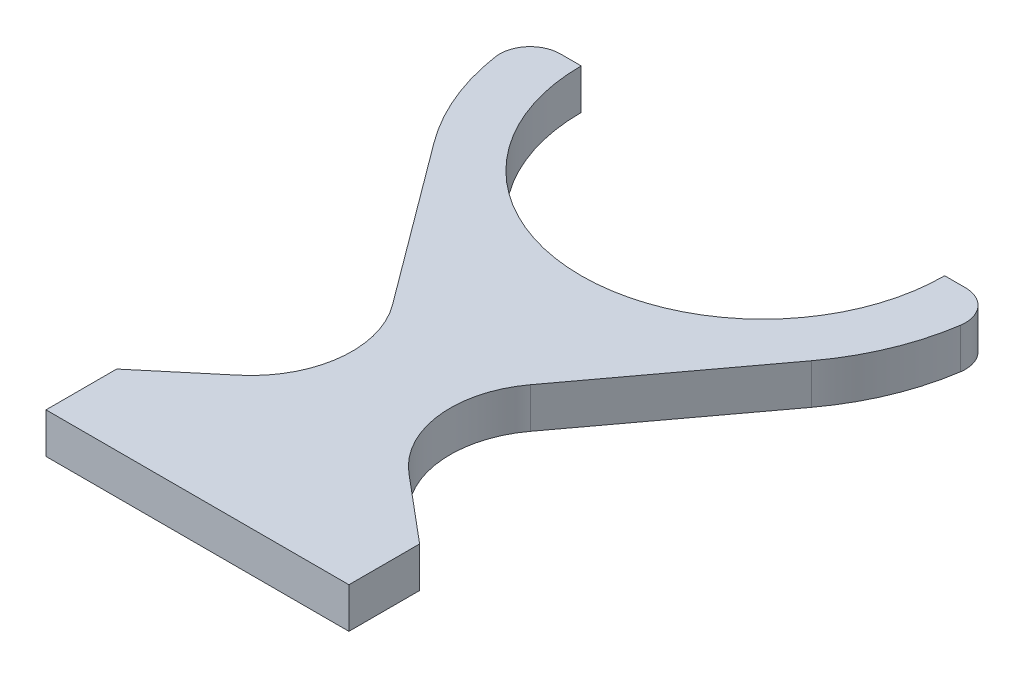
ISO-10303-21;
HEADER;
FILE_DESCRIPTION(('STEP AP214'),'2;1');
FILE_NAME('part.step','',(''),(''),'','','');
FILE_SCHEMA(('AUTOMOTIVE_DESIGN { 1 0 10303 214 1 1 1 1 }'));
ENDSEC;
DATA;
#1=APPLICATION_CONTEXT('core data for automotive mechanical design processes');
#2=APPLICATION_PROTOCOL_DEFINITION('international standard','automotive_design',2000,#1);
#3=PRODUCT_CONTEXT('',#1,'mechanical');
#4=PRODUCT('Part','Part','',(#3));
#5=PRODUCT_RELATED_PRODUCT_CATEGORY('part','',(#4));
#6=PRODUCT_DEFINITION_FORMATION('','',#4);
#7=PRODUCT_DEFINITION_CONTEXT('part definition',#1,'design');
#8=PRODUCT_DEFINITION('design','',#6,#7);
#9=PRODUCT_DEFINITION_SHAPE('','',#8);
#10=(LENGTH_UNIT() NAMED_UNIT(*) SI_UNIT(.MILLI.,.METRE.));
#11=(NAMED_UNIT(*) PLANE_ANGLE_UNIT() SI_UNIT($,.RADIAN.));
#12=(NAMED_UNIT(*) SI_UNIT($,.STERADIAN.) SOLID_ANGLE_UNIT());
#13=UNCERTAINTY_MEASURE_WITH_UNIT(LENGTH_MEASURE(1.E-05),#10,'distance_accuracy_value','');
#14=(GEOMETRIC_REPRESENTATION_CONTEXT(3) GLOBAL_UNCERTAINTY_ASSIGNED_CONTEXT((#13)) GLOBAL_UNIT_ASSIGNED_CONTEXT((#10,
#11,#12)) REPRESENTATION_CONTEXT('',''));
#15=CARTESIAN_POINT('',(0.,0.,0.));
#16=DIRECTION('',(0.,0.,1.));
#17=DIRECTION('',(1.,0.,0.));
#18=AXIS2_PLACEMENT_3D('',#15,#16,#17);
#19=CARTESIAN_POINT('',(0.,20.,0.));
#20=DIRECTION('',(0.,1.,0.));
#21=DIRECTION('',(0.,0.,1.));
#22=AXIS2_PLACEMENT_3D('',#19,#20,#21);
#23=PLANE('',#22);
#24=CARTESIAN_POINT('',(0.,20.,-280.));
#25=DIRECTION('',(0.,1.,0.));
#26=DIRECTION('',(0.,0.,1.));
#27=AXIS2_PLACEMENT_3D('',#24,#25,#26);
#28=CIRCLE('',#27,116.421991203938);
#29=CARTESIAN_POINT('',(93.4764140406187,20.,-210.60086416967));
#30=VERTEX_POINT('',#29);
#31=CARTESIAN_POINT('',(115.141673104201,20.,-262.781546217648));
#32=VERTEX_POINT('',#31);
#33=EDGE_CURVE('E314',#30,#32,#28,.T.);
#34=ORIENTED_EDGE('',*,*,#33,.T.);
#35=CARTESIAN_POINT('',(100.306631384827,20.,-265.));
#36=DIRECTION('',(0.,1.,0.));
#37=DIRECTION('',(0.,0.,1.));
#38=AXIS2_PLACEMENT_3D('',#35,#36,#37);
#39=CIRCLE('',#38,15.);
#40=CARTESIAN_POINT('',(100.306631384827,20.,-280.));
#41=VERTEX_POINT('',#40);
#42=EDGE_CURVE('E68',#32,#41,#39,.T.);
#43=ORIENTED_EDGE('',*,*,#42,.T.);
#44=DIRECTION('',(1.,0.,0.));
#45=VECTOR('',#44,1.);
#46=CARTESIAN_POINT('',(0.,20.,-280.));
#47=LINE('',#46,#45);
#48=CARTESIAN_POINT('',(90.,20.,-280.));
#49=VERTEX_POINT('',#48);
#50=EDGE_CURVE('E171',#49,#41,#47,.T.);
#51=ORIENTED_EDGE('',*,*,#50,.F.);
#52=CARTESIAN_POINT('',(0.,20.,-280.));
#53=DIRECTION('',(0.,1.,0.));
#54=DIRECTION('',(0.,0.,1.));
#55=AXIS2_PLACEMENT_3D('',#52,#53,#54);
#56=CIRCLE('',#55,90.);
#57=CARTESIAN_POINT('',(-90.,20.,-280.));
#58=VERTEX_POINT('',#57);
#59=EDGE_CURVE('E159',#58,#49,#56,.T.);
#60=ORIENTED_EDGE('',*,*,#59,.F.);
#61=DIRECTION('',(-1.,0.,0.));
#62=VECTOR('',#61,1.);
#63=CARTESIAN_POINT('',(0.,20.,-280.));
#64=LINE('',#63,#62);
#65=CARTESIAN_POINT('',(-100.306631384827,20.,-280.));
#66=VERTEX_POINT('',#65);
#67=EDGE_CURVE('E233',#58,#66,#64,.T.);
#68=ORIENTED_EDGE('',*,*,#67,.T.);
#69=CARTESIAN_POINT('',(-100.306631384827,20.,-265.));
#70=DIRECTION('',(0.,1.,0.));
#71=DIRECTION('',(0.,0.,1.));
#72=AXIS2_PLACEMENT_3D('',#69,#70,#71);
#73=CIRCLE('',#72,15.);
#74=CARTESIAN_POINT('',(-115.141673104201,20.,-262.781546217648));
#75=VERTEX_POINT('',#74);
#76=EDGE_CURVE('E280',#66,#75,#73,.T.);
#77=ORIENTED_EDGE('',*,*,#76,.T.);
#78=CARTESIAN_POINT('',(0.,20.,-280.));
#79=DIRECTION('',(0.,-1.,0.));
#80=DIRECTION('',(0.,0.,1.));
#81=AXIS2_PLACEMENT_3D('',#78,#79,#80);
#82=CIRCLE('',#81,116.421991203938);
#83=CARTESIAN_POINT('',(-93.4764140406187,20.,-210.60086416967));
#84=VERTEX_POINT('',#83);
#85=EDGE_CURVE('E168',#84,#75,#82,.T.);
#86=ORIENTED_EDGE('',*,*,#85,.F.);
#87=DIRECTION('',(0.596099887252078,0.,0.802910284165087));
#88=VECTOR('',#87,1.);
#89=CARTESIAN_POINT('',(-6.05600011929235,20.,-92.850884871789));
#90=LINE('',#89,#88);
#91=CARTESIAN_POINT('',(-34.1384260953024,20.,-130.676204256405));
#92=VERTEX_POINT('',#91);
#93=EDGE_CURVE('E236',#84,#92,#90,.T.);
#94=ORIENTED_EDGE('',*,*,#93,.T.);
#95=CARTESIAN_POINT('',(-74.2839403035567,20.,-100.871209893801));
#96=DIRECTION('',(0.,1.,0.));
#97=DIRECTION('',(0.,0.,1.));
#98=AXIS2_PLACEMENT_3D('',#95,#96,#97);
#99=CIRCLE('',#98,50.);
#100=CARTESIAN_POINT('',(-42.1445598192295,20.,-62.5689877378521));
#101=VERTEX_POINT('',#100);
#102=EDGE_CURVE('E273',#92,#101,#99,.F.);
#103=ORIENTED_EDGE('',*,*,#102,.T.);
#104=DIRECTION('',(-0.766044443118974,0.,0.642787609686544));
#105=VECTOR('',#104,1.);
#106=CARTESIAN_POINT('',(-75.,20.,-35.));
#107=LINE('',#106,#105);
#108=CARTESIAN_POINT('',(-75.,20.,-35.));
#109=VERTEX_POINT('',#108);
#110=EDGE_CURVE('E223',#101,#109,#107,.T.);
#111=ORIENTED_EDGE('',*,*,#110,.T.);
#112=DIRECTION('',(0.,0.,1.));
#113=VECTOR('',#112,1.);
#114=CARTESIAN_POINT('',(-75.,20.,-35.));
#115=LINE('',#114,#113);
#116=CARTESIAN_POINT('',(-75.,20.,0.));
#117=VERTEX_POINT('',#116);
#118=EDGE_CURVE('E226',#109,#117,#115,.T.);
#119=ORIENTED_EDGE('',*,*,#118,.T.);
#120=DIRECTION('',(1.,0.,0.));
#121=VECTOR('',#120,1.);
#122=CARTESIAN_POINT('',(-75.,20.,0.));
#123=LINE('',#122,#121);
#124=CARTESIAN_POINT('',(75.,20.,0.));
#125=VERTEX_POINT('',#124);
#126=EDGE_CURVE('E230',#117,#125,#123,.T.);
#127=ORIENTED_EDGE('',*,*,#126,.T.);
#128=DIRECTION('',(0.,0.,1.));
#129=VECTOR('',#128,1.);
#130=CARTESIAN_POINT('',(75.,20.,-35.));
#131=LINE('',#130,#129);
#132=CARTESIAN_POINT('',(75.,20.,-35.));
#133=VERTEX_POINT('',#132);
#134=EDGE_CURVE('E178',#133,#125,#131,.T.);
#135=ORIENTED_EDGE('',*,*,#134,.F.);
#136=DIRECTION('',(0.766044443118974,0.,0.642787609686544));
#137=VECTOR('',#136,1.);
#138=CARTESIAN_POINT('',(75.,20.,-35.));
#139=LINE('',#138,#137);
#140=CARTESIAN_POINT('',(42.1445598192295,20.,-62.5689877378521));
#141=VERTEX_POINT('',#140);
#142=EDGE_CURVE('E186',#141,#133,#139,.T.);
#143=ORIENTED_EDGE('',*,*,#142,.F.);
#144=CARTESIAN_POINT('',(74.2839403035567,20.,-100.871209893801));
#145=DIRECTION('',(0.,1.,0.));
#146=DIRECTION('',(0.,0.,1.));
#147=AXIS2_PLACEMENT_3D('',#144,#145,#146);
#148=CIRCLE('',#147,50.);
#149=CARTESIAN_POINT('',(34.1384260953024,20.,-130.676204256405));
#150=VERTEX_POINT('',#149);
#151=EDGE_CURVE('E299',#141,#150,#148,.F.);
#152=ORIENTED_EDGE('',*,*,#151,.T.);
#153=DIRECTION('',(-0.596099887252078,0.,0.802910284165087));
#154=VECTOR('',#153,1.);
#155=CARTESIAN_POINT('',(6.05600011929235,20.,-92.850884871789));
#156=LINE('',#155,#154);
#157=EDGE_CURVE('E179',#30,#150,#156,.T.);
#158=ORIENTED_EDGE('',*,*,#157,.F.);
#159=EDGE_LOOP('',(#34,#43,#51,#60,#68,#77,#86,#94,#103,#111,#119,#127,#135,#143,#152,#158));
#160=FACE_BOUND('',#159,.T.);
#161=ADVANCED_FACE('F45',(#160),#23,.T.);
#162=CARTESIAN_POINT('',(0.,0.,0.));
#163=DIRECTION('',(0.,1.,0.));
#164=DIRECTION('',(0.,0.,1.));
#165=AXIS2_PLACEMENT_3D('',#162,#163,#164);
#166=PLANE('',#165);
#167=DIRECTION('',(1.,0.,0.));
#168=VECTOR('',#167,1.);
#169=CARTESIAN_POINT('',(0.,0.,-280.));
#170=LINE('',#169,#168);
#171=CARTESIAN_POINT('',(90.,0.,-280.));
#172=VERTEX_POINT('',#171);
#173=CARTESIAN_POINT('',(100.306631384827,0.,-280.));
#174=VERTEX_POINT('',#173);
#175=EDGE_CURVE('E172',#172,#174,#170,.T.);
#176=ORIENTED_EDGE('',*,*,#175,.T.);
#177=CARTESIAN_POINT('',(100.306631384827,0.,-265.));
#178=DIRECTION('',(0.,1.,0.));
#179=DIRECTION('',(0.,0.,1.));
#180=AXIS2_PLACEMENT_3D('',#177,#178,#179);
#181=CIRCLE('',#180,15.);
#182=CARTESIAN_POINT('',(115.141673104201,0.,-262.781546217648));
#183=VERTEX_POINT('',#182);
#184=EDGE_CURVE('E11',#174,#183,#181,.F.);
#185=ORIENTED_EDGE('',*,*,#184,.T.);
#186=CARTESIAN_POINT('',(0.,0.,-280.));
#187=DIRECTION('',(0.,1.,0.));
#188=DIRECTION('',(0.,0.,1.));
#189=AXIS2_PLACEMENT_3D('',#186,#187,#188);
#190=CIRCLE('',#189,116.421991203938);
#191=CARTESIAN_POINT('',(93.4764140406187,0.,-210.60086416967));
#192=VERTEX_POINT('',#191);
#193=EDGE_CURVE('E175',#183,#192,#190,.F.);
#194=ORIENTED_EDGE('',*,*,#193,.T.);
#195=DIRECTION('',(-0.596099887252078,0.,0.802910284165087));
#196=VECTOR('',#195,1.);
#197=CARTESIAN_POINT('',(6.05600011929235,0.,-92.850884871789));
#198=LINE('',#197,#196);
#199=CARTESIAN_POINT('',(34.1384260953024,0.,-130.676204256405));
#200=VERTEX_POINT('',#199);
#201=EDGE_CURVE('E192',#192,#200,#198,.T.);
#202=ORIENTED_EDGE('',*,*,#201,.T.);
#203=CARTESIAN_POINT('',(74.2839403035567,0.,-100.871209893801));
#204=DIRECTION('',(0.,1.,0.));
#205=DIRECTION('',(0.,0.,1.));
#206=AXIS2_PLACEMENT_3D('',#203,#204,#205);
#207=CIRCLE('',#206,50.);
#208=CARTESIAN_POINT('',(42.1445598192295,0.,-62.5689877378521));
#209=VERTEX_POINT('',#208);
#210=EDGE_CURVE('E296',#200,#209,#207,.T.);
#211=ORIENTED_EDGE('',*,*,#210,.T.);
#212=DIRECTION('',(0.766044443118974,0.,0.642787609686544));
#213=VECTOR('',#212,1.);
#214=CARTESIAN_POINT('',(75.,0.,-35.));
#215=LINE('',#214,#213);
#216=CARTESIAN_POINT('',(75.,0.,-35.));
#217=VERTEX_POINT('',#216);
#218=EDGE_CURVE('E174',#209,#217,#215,.T.);
#219=ORIENTED_EDGE('',*,*,#218,.T.);
#220=DIRECTION('',(0.,0.,1.));
#221=VECTOR('',#220,1.);
#222=CARTESIAN_POINT('',(75.,0.,-35.));
#223=LINE('',#222,#221);
#224=CARTESIAN_POINT('',(75.,0.,0.));
#225=VERTEX_POINT('',#224);
#226=EDGE_CURVE('E197',#217,#225,#223,.T.);
#227=ORIENTED_EDGE('',*,*,#226,.T.);
#228=DIRECTION('',(1.,0.,0.));
#229=VECTOR('',#228,1.);
#230=CARTESIAN_POINT('',(-75.,0.,0.));
#231=LINE('',#230,#229);
#232=CARTESIAN_POINT('',(-75.,0.,0.));
#233=VERTEX_POINT('',#232);
#234=EDGE_CURVE('E245',#233,#225,#231,.T.);
#235=ORIENTED_EDGE('',*,*,#234,.F.);
#236=DIRECTION('',(0.,0.,1.));
#237=VECTOR('',#236,1.);
#238=CARTESIAN_POINT('',(-75.,0.,-35.));
#239=LINE('',#238,#237);
#240=CARTESIAN_POINT('',(-75.,0.,-35.));
#241=VERTEX_POINT('',#240);
#242=EDGE_CURVE('E242',#241,#233,#239,.T.);
#243=ORIENTED_EDGE('',*,*,#242,.F.);
#244=DIRECTION('',(-0.766044443118974,0.,0.642787609686544));
#245=VECTOR('',#244,1.);
#246=CARTESIAN_POINT('',(-75.,0.,-35.));
#247=LINE('',#246,#245);
#248=CARTESIAN_POINT('',(-42.1445598192295,0.,-62.5689877378521));
#249=VERTEX_POINT('',#248);
#250=EDGE_CURVE('E214',#249,#241,#247,.T.);
#251=ORIENTED_EDGE('',*,*,#250,.F.);
#252=CARTESIAN_POINT('',(-74.2839403035567,0.,-100.871209893801));
#253=DIRECTION('',(0.,1.,0.));
#254=DIRECTION('',(0.,0.,1.));
#255=AXIS2_PLACEMENT_3D('',#252,#253,#254);
#256=CIRCLE('',#255,50.);
#257=CARTESIAN_POINT('',(-34.1384260953024,0.,-130.676204256405));
#258=VERTEX_POINT('',#257);
#259=EDGE_CURVE('E269',#249,#258,#256,.T.);
#260=ORIENTED_EDGE('',*,*,#259,.T.);
#261=DIRECTION('',(0.596099887252078,0.,0.802910284165087));
#262=VECTOR('',#261,1.);
#263=CARTESIAN_POINT('',(-6.05600011929235,0.,-92.850884871789));
#264=LINE('',#263,#262);
#265=CARTESIAN_POINT('',(-93.4764140406187,0.,-210.60086416967));
#266=VERTEX_POINT('',#265);
#267=EDGE_CURVE('E227',#266,#258,#264,.T.);
#268=ORIENTED_EDGE('',*,*,#267,.F.);
#269=CARTESIAN_POINT('',(0.,0.,-280.));
#270=DIRECTION('',(0.,1.,0.));
#271=DIRECTION('',(0.,0.,1.));
#272=AXIS2_PLACEMENT_3D('',#269,#270,#271);
#273=CIRCLE('',#272,116.421991203938);
#274=CARTESIAN_POINT('',(-115.141673104201,0.,-262.781546217648));
#275=VERTEX_POINT('',#274);
#276=EDGE_CURVE('E207',#275,#266,#273,.T.);
#277=ORIENTED_EDGE('',*,*,#276,.F.);
#278=CARTESIAN_POINT('',(-100.306631384827,0.,-265.));
#279=DIRECTION('',(0.,1.,0.));
#280=DIRECTION('',(0.,0.,1.));
#281=AXIS2_PLACEMENT_3D('',#278,#279,#280);
#282=CIRCLE('',#281,15.);
#283=CARTESIAN_POINT('',(-100.306631384827,0.,-280.));
#284=VERTEX_POINT('',#283);
#285=EDGE_CURVE('E286',#275,#284,#282,.F.);
#286=ORIENTED_EDGE('',*,*,#285,.T.);
#287=DIRECTION('',(-1.,0.,0.));
#288=VECTOR('',#287,1.);
#289=CARTESIAN_POINT('',(0.,0.,-280.));
#290=LINE('',#289,#288);
#291=CARTESIAN_POINT('',(-90.,0.,-280.));
#292=VERTEX_POINT('',#291);
#293=EDGE_CURVE('E248',#292,#284,#290,.T.);
#294=ORIENTED_EDGE('',*,*,#293,.F.);
#295=CARTESIAN_POINT('',(0.,0.,-280.));
#296=DIRECTION('',(0.,1.,0.));
#297=DIRECTION('',(0.,0.,1.));
#298=AXIS2_PLACEMENT_3D('',#295,#296,#297);
#299=CIRCLE('',#298,90.);
#300=EDGE_CURVE('E211',#172,#292,#299,.F.);
#301=ORIENTED_EDGE('',*,*,#300,.F.);
#302=EDGE_LOOP('',(#176,#185,#194,#202,#211,#219,#227,#235,#243,#251,#260,#268,#277,#286,#294,#301));
#303=FACE_BOUND('',#302,.T.);
#304=ADVANCED_FACE('F346',(#303),#166,.F.);
#305=CARTESIAN_POINT('',(6.05600011929235,20.,-92.850884871789));
#306=DIRECTION('',(0.802910284165087,0.,0.596099887252078));
#307=DIRECTION('',(0.596099887252078,0.,-0.802910284165087));
#308=AXIS2_PLACEMENT_3D('',#305,#306,#307);
#309=PLANE('',#308);
#310=ORIENTED_EDGE('',*,*,#201,.F.);
#311=DIRECTION('',(0.,1.,0.));
#312=VECTOR('',#311,1.);
#313=CARTESIAN_POINT('',(93.4764140406187,-127.279220613579,-210.60086416967));
#314=LINE('',#313,#312);
#315=EDGE_CURVE('E320',#192,#30,#314,.T.);
#316=ORIENTED_EDGE('',*,*,#315,.T.);
#317=ORIENTED_EDGE('',*,*,#157,.T.);
#318=DIRECTION('',(0.,-1.,0.));
#319=VECTOR('',#318,1.);
#320=CARTESIAN_POINT('',(34.1384260953024,0.,-130.676204256405));
#321=LINE('',#320,#319);
#322=EDGE_CURVE('E289',#150,#200,#321,.T.);
#323=ORIENTED_EDGE('',*,*,#322,.T.);
#324=EDGE_LOOP('',(#310,#316,#317,#323));
#325=FACE_BOUND('',#324,.T.);
#326=ADVANCED_FACE('F354',(#325),#309,.T.);
#327=CARTESIAN_POINT('',(0.,20.,-280.));
#328=DIRECTION('',(0.,0.,-1.));
#329=DIRECTION('',(-1.,0.,0.));
#330=AXIS2_PLACEMENT_3D('',#327,#328,#329);
#331=PLANE('',#330);
#332=ORIENTED_EDGE('',*,*,#50,.T.);
#333=DIRECTION('',(0.,1.,0.));
#334=VECTOR('',#333,1.);
#335=CARTESIAN_POINT('',(100.306631384827,20.,-280.));
#336=LINE('',#335,#334);
#337=EDGE_CURVE('E54',#41,#174,#336,.F.);
#338=ORIENTED_EDGE('',*,*,#337,.T.);
#339=ORIENTED_EDGE('',*,*,#175,.F.);
#340=DIRECTION('',(0.,1.,0.));
#341=VECTOR('',#340,1.);
#342=CARTESIAN_POINT('',(90.,-127.279220613579,-280.));
#343=LINE('',#342,#341);
#344=EDGE_CURVE('E162',#172,#49,#343,.T.);
#345=ORIENTED_EDGE('',*,*,#344,.T.);
#346=EDGE_LOOP('',(#332,#338,#339,#345));
#347=FACE_BOUND('',#346,.T.);
#348=ADVANCED_FACE('F170',(#347),#331,.T.);
#349=CARTESIAN_POINT('',(-75.,20.,-35.));
#350=DIRECTION('',(0.642787609686545,0.,0.766044443118974));
#351=DIRECTION('',(0.766044443118974,0.,-0.642787609686545));
#352=AXIS2_PLACEMENT_3D('',#349,#350,#351);
#353=PLANE('',#352);
#354=ORIENTED_EDGE('',*,*,#110,.F.);
#355=DIRECTION('',(0.,-1.,0.));
#356=VECTOR('',#355,1.);
#357=CARTESIAN_POINT('',(-42.1445598192295,0.,-62.5689877378521));
#358=LINE('',#357,#356);
#359=EDGE_CURVE('E261',#101,#249,#358,.T.);
#360=ORIENTED_EDGE('',*,*,#359,.T.);
#361=ORIENTED_EDGE('',*,*,#250,.T.);
#362=DIRECTION('',(0.,-1.,0.));
#363=VECTOR('',#362,1.);
#364=CARTESIAN_POINT('',(-75.,20.,-35.));
#365=LINE('',#364,#363);
#366=EDGE_CURVE('E257',#109,#241,#365,.T.);
#367=ORIENTED_EDGE('',*,*,#366,.F.);
#368=EDGE_LOOP('',(#354,#360,#361,#367));
#369=FACE_BOUND('',#368,.T.);
#370=ADVANCED_FACE('F385',(#369),#353,.F.);
#371=CARTESIAN_POINT('',(-75.,20.,-35.));
#372=DIRECTION('',(1.,0.,0.));
#373=DIRECTION('',(0.,0.,-1.));
#374=AXIS2_PLACEMENT_3D('',#371,#372,#373);
#375=PLANE('',#374);
#376=ORIENTED_EDGE('',*,*,#242,.T.);
#377=DIRECTION('',(0.,-1.,0.));
#378=VECTOR('',#377,1.);
#379=CARTESIAN_POINT('',(-75.,20.,0.));
#380=LINE('',#379,#378);
#381=EDGE_CURVE('E239',#117,#233,#380,.T.);
#382=ORIENTED_EDGE('',*,*,#381,.F.);
#383=ORIENTED_EDGE('',*,*,#118,.F.);
#384=ORIENTED_EDGE('',*,*,#366,.T.);
#385=EDGE_LOOP('',(#376,#382,#383,#384));
#386=FACE_BOUND('',#385,.T.);
#387=ADVANCED_FACE('F382',(#386),#375,.F.);
#388=CARTESIAN_POINT('',(-75.,20.,0.));
#389=DIRECTION('',(0.,0.,-1.));
#390=DIRECTION('',(-1.,0.,0.));
#391=AXIS2_PLACEMENT_3D('',#388,#389,#390);
#392=PLANE('',#391);
#393=ORIENTED_EDGE('',*,*,#234,.T.);
#394=DIRECTION('',(0.,-1.,0.));
#395=VECTOR('',#394,1.);
#396=CARTESIAN_POINT('',(75.,20.,0.));
#397=LINE('',#396,#395);
#398=EDGE_CURVE('E204',#125,#225,#397,.T.);
#399=ORIENTED_EDGE('',*,*,#398,.F.);
#400=ORIENTED_EDGE('',*,*,#126,.F.);
#401=ORIENTED_EDGE('',*,*,#381,.T.);
#402=EDGE_LOOP('',(#393,#399,#400,#401));
#403=FACE_BOUND('',#402,.T.);
#404=ADVANCED_FACE('F343',(#403),#392,.F.);
#405=CARTESIAN_POINT('',(0.,20.,-280.));
#406=DIRECTION('',(0.,0.,1.));
#407=DIRECTION('',(1.,0.,0.));
#408=AXIS2_PLACEMENT_3D('',#405,#406,#407);
#409=PLANE('',#408);
#410=ORIENTED_EDGE('',*,*,#293,.T.);
#411=DIRECTION('',(0.,1.,0.));
#412=VECTOR('',#411,1.);
#413=CARTESIAN_POINT('',(-100.306631384827,20.,-280.));
#414=LINE('',#413,#412);
#415=EDGE_CURVE('E276',#284,#66,#414,.T.);
#416=ORIENTED_EDGE('',*,*,#415,.T.);
#417=ORIENTED_EDGE('',*,*,#67,.F.);
#418=DIRECTION('',(0.,1.,0.));
#419=VECTOR('',#418,1.);
#420=CARTESIAN_POINT('',(-90.,-127.279220613579,-280.));
#421=LINE('',#420,#419);
#422=EDGE_CURVE('E164',#292,#58,#421,.T.);
#423=ORIENTED_EDGE('',*,*,#422,.F.);
#424=EDGE_LOOP('',(#410,#416,#417,#423));
#425=FACE_BOUND('',#424,.T.);
#426=ADVANCED_FACE('F375',(#425),#409,.F.);
#427=CARTESIAN_POINT('',(-6.05600011929235,20.,-92.850884871789));
#428=DIRECTION('',(0.802910284165087,0.,-0.596099887252078));
#429=DIRECTION('',(-0.596099887252078,0.,-0.802910284165087));
#430=AXIS2_PLACEMENT_3D('',#427,#428,#429);
#431=PLANE('',#430);
#432=ORIENTED_EDGE('',*,*,#93,.F.);
#433=DIRECTION('',(0.,1.,0.));
#434=VECTOR('',#433,1.);
#435=CARTESIAN_POINT('',(-93.4764140406187,-127.279220613579,-210.60086416967));
#436=LINE('',#435,#434);
#437=EDGE_CURVE('E215',#266,#84,#436,.T.);
#438=ORIENTED_EDGE('',*,*,#437,.F.);
#439=ORIENTED_EDGE('',*,*,#267,.T.);
#440=DIRECTION('',(0.,-1.,0.));
#441=VECTOR('',#440,1.);
#442=CARTESIAN_POINT('',(-34.1384260953024,20.,-130.676204256405));
#443=LINE('',#442,#441);
#444=EDGE_CURVE('E265',#258,#92,#443,.F.);
#445=ORIENTED_EDGE('',*,*,#444,.T.);
#446=EDGE_LOOP('',(#432,#438,#439,#445));
#447=FACE_BOUND('',#446,.T.);
#448=ADVANCED_FACE('F371',(#447),#431,.F.);
#449=CARTESIAN_POINT('',(-74.2839403035567,20.,-100.871209893801));
#450=DIRECTION('',(0.,1.,0.));
#451=DIRECTION('',(0.,0.,1.));
#452=AXIS2_PLACEMENT_3D('',#449,#450,#451);
#453=CYLINDRICAL_SURFACE('',#452,50.);
#454=ORIENTED_EDGE('',*,*,#102,.F.);
#455=ORIENTED_EDGE('',*,*,#444,.F.);
#456=ORIENTED_EDGE('',*,*,#259,.F.);
#457=ORIENTED_EDGE('',*,*,#359,.F.);
#458=EDGE_LOOP('',(#454,#455,#456,#457));
#459=FACE_BOUND('',#458,.T.);
#460=ADVANCED_FACE('F374',(#459),#453,.F.);
#461=CARTESIAN_POINT('',(0.,-127.279220613579,-280.));
#462=DIRECTION('',(0.,1.,0.));
#463=DIRECTION('',(0.,0.,1.));
#464=AXIS2_PLACEMENT_3D('',#461,#462,#463);
#465=CYLINDRICAL_SURFACE('',#464,116.421991203938);
#466=ORIENTED_EDGE('',*,*,#85,.T.);
#467=DIRECTION('',(0.,1.,0.));
#468=VECTOR('',#467,1.);
#469=CARTESIAN_POINT('',(-115.141673104201,-127.279220613579,-262.781546217648));
#470=LINE('',#469,#468);
#471=EDGE_CURVE('E283',#75,#275,#470,.F.);
#472=ORIENTED_EDGE('',*,*,#471,.T.);
#473=ORIENTED_EDGE('',*,*,#276,.T.);
#474=ORIENTED_EDGE('',*,*,#437,.T.);
#475=EDGE_LOOP('',(#466,#472,#473,#474));
#476=FACE_BOUND('',#475,.T.);
#477=ADVANCED_FACE('F368',(#476),#465,.T.);
#478=CARTESIAN_POINT('',(0.,-127.279220613579,-280.));
#479=DIRECTION('',(0.,1.,0.));
#480=DIRECTION('',(0.,0.,1.));
#481=AXIS2_PLACEMENT_3D('',#478,#479,#480);
#482=CYLINDRICAL_SURFACE('',#481,90.);
#483=ORIENTED_EDGE('',*,*,#300,.T.);
#484=ORIENTED_EDGE('',*,*,#422,.T.);
#485=ORIENTED_EDGE('',*,*,#59,.T.);
#486=ORIENTED_EDGE('',*,*,#344,.F.);
#487=EDGE_LOOP('',(#483,#484,#485,#486));
#488=FACE_BOUND('',#487,.T.);
#489=ADVANCED_FACE('F161',(#488),#482,.F.);
#490=CARTESIAN_POINT('',(-100.306631384827,-127.279220613579,-265.));
#491=DIRECTION('',(0.,1.,0.));
#492=DIRECTION('',(0.,0.,1.));
#493=AXIS2_PLACEMENT_3D('',#490,#491,#492);
#494=CYLINDRICAL_SURFACE('',#493,15.);
#495=ORIENTED_EDGE('',*,*,#285,.F.);
#496=ORIENTED_EDGE('',*,*,#471,.F.);
#497=ORIENTED_EDGE('',*,*,#76,.F.);
#498=ORIENTED_EDGE('',*,*,#415,.F.);
#499=EDGE_LOOP('',(#495,#496,#497,#498));
#500=FACE_BOUND('',#499,.T.);
#501=ADVANCED_FACE('F393',(#500),#494,.T.);
#502=CARTESIAN_POINT('',(75.,20.,-35.));
#503=DIRECTION('',(0.642787609686545,0.,-0.766044443118974));
#504=DIRECTION('',(-0.766044443118974,0.,-0.642787609686545));
#505=AXIS2_PLACEMENT_3D('',#502,#503,#504);
#506=PLANE('',#505);
#507=ORIENTED_EDGE('',*,*,#218,.F.);
#508=DIRECTION('',(0.,-1.,0.));
#509=VECTOR('',#508,1.);
#510=CARTESIAN_POINT('',(42.1445598192295,20.,-62.5689877378521));
#511=LINE('',#510,#509);
#512=EDGE_CURVE('E293',#209,#141,#511,.F.);
#513=ORIENTED_EDGE('',*,*,#512,.T.);
#514=ORIENTED_EDGE('',*,*,#142,.T.);
#515=DIRECTION('',(0.,-1.,0.));
#516=VECTOR('',#515,1.);
#517=CARTESIAN_POINT('',(75.,20.,-35.));
#518=LINE('',#517,#516);
#519=EDGE_CURVE('E184',#133,#217,#518,.T.);
#520=ORIENTED_EDGE('',*,*,#519,.T.);
#521=EDGE_LOOP('',(#507,#513,#514,#520));
#522=FACE_BOUND('',#521,.T.);
#523=ADVANCED_FACE('F331',(#522),#506,.T.);
#524=CARTESIAN_POINT('',(75.,20.,-35.));
#525=DIRECTION('',(1.,0.,0.));
#526=DIRECTION('',(0.,0.,-1.));
#527=AXIS2_PLACEMENT_3D('',#524,#525,#526);
#528=PLANE('',#527);
#529=ORIENTED_EDGE('',*,*,#226,.F.);
#530=ORIENTED_EDGE('',*,*,#519,.F.);
#531=ORIENTED_EDGE('',*,*,#134,.T.);
#532=ORIENTED_EDGE('',*,*,#398,.T.);
#533=EDGE_LOOP('',(#529,#530,#531,#532));
#534=FACE_BOUND('',#533,.T.);
#535=ADVANCED_FACE('F337',(#534),#528,.T.);
#536=CARTESIAN_POINT('',(74.2839403035567,20.,-100.871209893801));
#537=DIRECTION('',(0.,1.,0.));
#538=DIRECTION('',(0.,0.,1.));
#539=AXIS2_PLACEMENT_3D('',#536,#537,#538);
#540=CYLINDRICAL_SURFACE('',#539,50.);
#541=ORIENTED_EDGE('',*,*,#151,.F.);
#542=ORIENTED_EDGE('',*,*,#512,.F.);
#543=ORIENTED_EDGE('',*,*,#210,.F.);
#544=ORIENTED_EDGE('',*,*,#322,.F.);
#545=EDGE_LOOP('',(#541,#542,#543,#544));
#546=FACE_BOUND('',#545,.T.);
#547=ADVANCED_FACE('F350',(#546),#540,.F.);
#548=CARTESIAN_POINT('',(0.,-127.279220613579,-280.));
#549=DIRECTION('',(0.,1.,0.));
#550=DIRECTION('',(0.,0.,1.));
#551=AXIS2_PLACEMENT_3D('',#548,#549,#550);
#552=CYLINDRICAL_SURFACE('',#551,116.421991203938);
#553=ORIENTED_EDGE('',*,*,#193,.F.);
#554=DIRECTION('',(0.,1.,0.));
#555=VECTOR('',#554,1.);
#556=CARTESIAN_POINT('',(115.141673104201,-127.279220613579,-262.781546217648));
#557=LINE('',#556,#555);
#558=EDGE_CURVE('E303',#183,#32,#557,.T.);
#559=ORIENTED_EDGE('',*,*,#558,.T.);
#560=ORIENTED_EDGE('',*,*,#33,.F.);
#561=ORIENTED_EDGE('',*,*,#315,.F.);
#562=EDGE_LOOP('',(#553,#559,#560,#561));
#563=FACE_BOUND('',#562,.T.);
#564=ADVANCED_FACE('F312',(#563),#552,.T.);
#565=CARTESIAN_POINT('',(100.306631384827,-127.279220613579,-265.));
#566=DIRECTION('',(0.,1.,0.));
#567=DIRECTION('',(0.,0.,1.));
#568=AXIS2_PLACEMENT_3D('',#565,#566,#567);
#569=CYLINDRICAL_SURFACE('',#568,15.);
#570=ORIENTED_EDGE('',*,*,#184,.F.);
#571=ORIENTED_EDGE('',*,*,#337,.F.);
#572=ORIENTED_EDGE('',*,*,#42,.F.);
#573=ORIENTED_EDGE('',*,*,#558,.F.);
#574=EDGE_LOOP('',(#570,#571,#572,#573));
#575=FACE_BOUND('',#574,.T.);
#576=ADVANCED_FACE('F47',(#575),#569,.T.);
#577=CLOSED_SHELL('',(#161,#304,#326,#348,#370,#387,#404,#426,#448,#460,#477,#489,#501,#523,
#535,#547,#564,#576));
#578=MANIFOLD_SOLID_BREP('B2',#577);
#579=ADVANCED_BREP_SHAPE_REPRESENTATION('',(#18,#578),#14);
#580=SHAPE_DEFINITION_REPRESENTATION(#9,#579);
ENDSEC;
END-ISO-10303-21;
